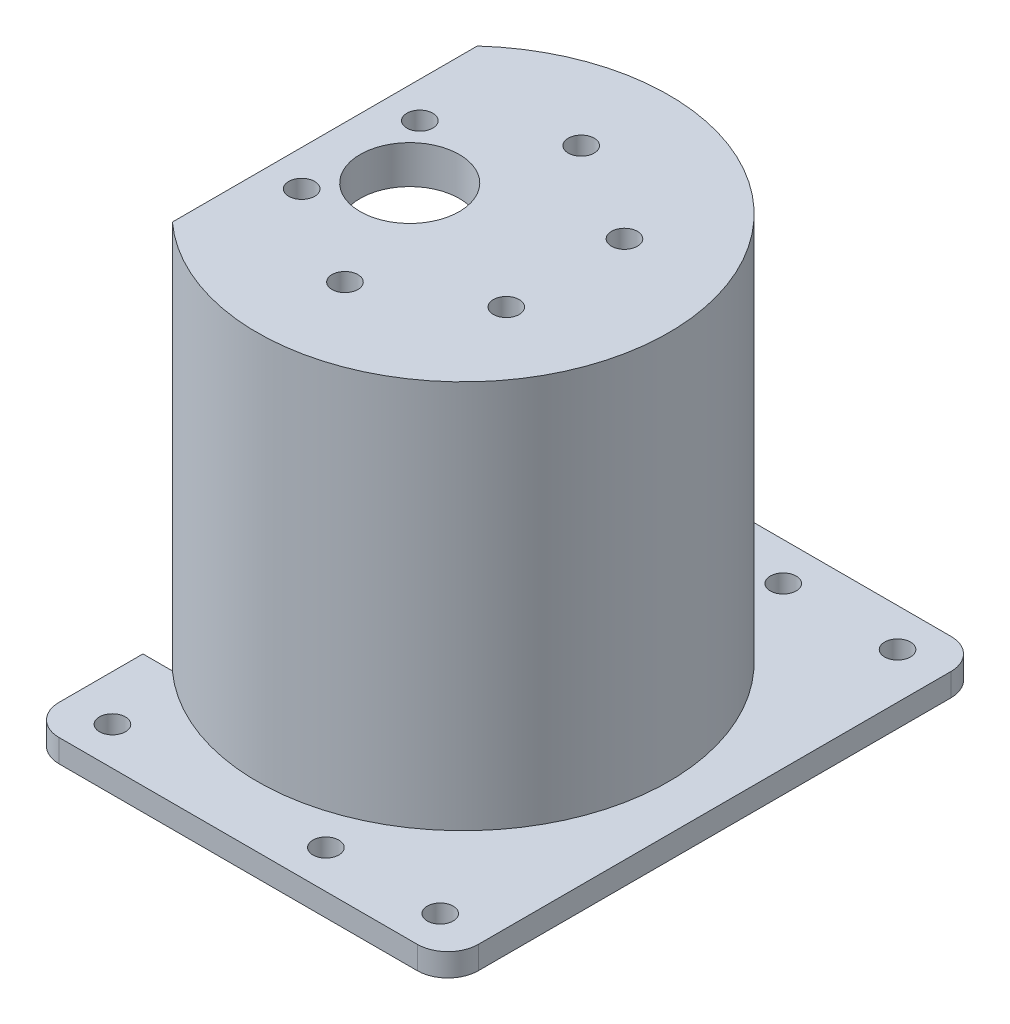
ISO-10303-21;
HEADER;
FILE_DESCRIPTION(('STEP AP214'),'2;1');
FILE_NAME('part.step','',(''),(''),'','','');
FILE_SCHEMA(('AUTOMOTIVE_DESIGN { 1 0 10303 214 1 1 1 1 }'));
ENDSEC;
DATA;
#1=APPLICATION_CONTEXT('core data for automotive mechanical design processes');
#2=APPLICATION_PROTOCOL_DEFINITION('international standard','automotive_design',2000,#1);
#3=PRODUCT_CONTEXT('',#1,'mechanical');
#4=PRODUCT('Part','Part','',(#3));
#5=PRODUCT_RELATED_PRODUCT_CATEGORY('part','',(#4));
#6=PRODUCT_DEFINITION_FORMATION('','',#4);
#7=PRODUCT_DEFINITION_CONTEXT('part definition',#1,'design');
#8=PRODUCT_DEFINITION('design','',#6,#7);
#9=PRODUCT_DEFINITION_SHAPE('','',#8);
#10=(LENGTH_UNIT() NAMED_UNIT(*) SI_UNIT(.MILLI.,.METRE.));
#11=(NAMED_UNIT(*) PLANE_ANGLE_UNIT() SI_UNIT($,.RADIAN.));
#12=(NAMED_UNIT(*) SI_UNIT($,.STERADIAN.) SOLID_ANGLE_UNIT());
#13=UNCERTAINTY_MEASURE_WITH_UNIT(LENGTH_MEASURE(1.E-05),#10,'distance_accuracy_value','');
#14=(GEOMETRIC_REPRESENTATION_CONTEXT(3) GLOBAL_UNCERTAINTY_ASSIGNED_CONTEXT((#13)) GLOBAL_UNIT_ASSIGNED_CONTEXT((#10,
#11,#12)) REPRESENTATION_CONTEXT('',''));
#15=CARTESIAN_POINT('',(0.,0.,0.));
#16=DIRECTION('',(0.,0.,1.));
#17=DIRECTION('',(1.,0.,0.));
#18=AXIS2_PLACEMENT_3D('',#15,#16,#17);
#19=CARTESIAN_POINT('',(-27.5,3.,-20.));
#20=DIRECTION('',(0.,0.,-1.));
#21=DIRECTION('',(-1.,0.,0.));
#22=AXIS2_PLACEMENT_3D('',#19,#20,#21);
#23=PLANE('',#22);
#24=DIRECTION('',(1.,0.,0.));
#25=VECTOR('',#24,1.);
#26=CARTESIAN_POINT('',(-27.5,49.,-20.));
#27=LINE('',#26,#25);
#28=CARTESIAN_POINT('',(-23.638357147217,49.,-20.));
#29=VERTEX_POINT('',#28);
#30=CARTESIAN_POINT('',(-12.5,49.,-20.));
#31=VERTEX_POINT('',#30);
#32=EDGE_CURVE('E174',#29,#31,#27,.T.);
#33=ORIENTED_EDGE('',*,*,#32,.F.);
#34=DIRECTION('',(0.,-1.,0.));
#35=VECTOR('',#34,1.);
#36=CARTESIAN_POINT('',(-23.638357147217,54.,-20.));
#37=LINE('',#36,#35);
#38=CARTESIAN_POINT('',(-23.638357147217,3.,-20.));
#39=VERTEX_POINT('',#38);
#40=EDGE_CURVE('E169',#29,#39,#37,.T.);
#41=ORIENTED_EDGE('',*,*,#40,.T.);
#42=DIRECTION('',(1.,0.,0.));
#43=VECTOR('',#42,1.);
#44=CARTESIAN_POINT('',(-27.5,3.,-20.));
#45=LINE('',#44,#43);
#46=CARTESIAN_POINT('',(-27.5,3.,-20.));
#47=VERTEX_POINT('',#46);
#48=EDGE_CURVE('E214',#47,#39,#45,.T.);
#49=ORIENTED_EDGE('',*,*,#48,.F.);
#50=DIRECTION('',(0.,-1.,0.));
#51=VECTOR('',#50,1.);
#52=CARTESIAN_POINT('',(-27.5,3.,-20.));
#53=LINE('',#52,#51);
#54=CARTESIAN_POINT('',(-27.5,0.,-20.));
#55=VERTEX_POINT('',#54);
#56=EDGE_CURVE('E263',#47,#55,#53,.T.);
#57=ORIENTED_EDGE('',*,*,#56,.T.);
#58=DIRECTION('',(1.,0.,0.));
#59=VECTOR('',#58,1.);
#60=CARTESIAN_POINT('',(-27.5,0.,-20.));
#61=LINE('',#60,#59);
#62=CARTESIAN_POINT('',(-12.5,0.,-20.));
#63=VERTEX_POINT('',#62);
#64=EDGE_CURVE('E237',#55,#63,#61,.T.);
#65=ORIENTED_EDGE('',*,*,#64,.T.);
#66=DIRECTION('',(0.,-1.,0.));
#67=VECTOR('',#66,1.);
#68=CARTESIAN_POINT('',(-12.5,3.,-20.));
#69=LINE('',#68,#67);
#70=EDGE_CURVE('E184',#31,#63,#69,.T.);
#71=ORIENTED_EDGE('',*,*,#70,.F.);
#72=EDGE_LOOP('',(#33,#41,#49,#57,#65,#71));
#73=FACE_BOUND('',#72,.T.);
#74=ADVANCED_FACE('F41',(#73),#23,.F.);
#75=CARTESIAN_POINT('',(-12.5,3.,-24.));
#76=DIRECTION('',(0.,-1.,0.));
#77=DIRECTION('',(0.,0.,-1.));
#78=AXIS2_PLACEMENT_3D('',#75,#76,#77);
#79=CYLINDRICAL_SURFACE('',#78,4.);
#80=CARTESIAN_POINT('',(-12.5,49.,-24.));
#81=DIRECTION('',(0.,1.,0.));
#82=DIRECTION('',(0.,0.,1.));
#83=AXIS2_PLACEMENT_3D('',#80,#81,#82);
#84=CIRCLE('',#83,4.);
#85=CARTESIAN_POINT('',(-11.38,49.,-20.16));
#86=VERTEX_POINT('',#85);
#87=EDGE_CURVE('E186',#31,#86,#84,.T.);
#88=ORIENTED_EDGE('',*,*,#87,.F.);
#89=ORIENTED_EDGE('',*,*,#70,.T.);
#90=CARTESIAN_POINT('',(-12.5,0.,-24.));
#91=DIRECTION('',(0.,1.,0.));
#92=DIRECTION('',(0.,0.,1.));
#93=AXIS2_PLACEMENT_3D('',#90,#91,#92);
#94=CIRCLE('',#93,4.);
#95=CARTESIAN_POINT('',(-11.38,0.,-20.16));
#96=VERTEX_POINT('',#95);
#97=EDGE_CURVE('E239',#63,#96,#94,.T.);
#98=ORIENTED_EDGE('',*,*,#97,.T.);
#99=DIRECTION('',(0.,-1.,0.));
#100=VECTOR('',#99,1.);
#101=CARTESIAN_POINT('',(-11.38,3.,-20.16));
#102=LINE('',#101,#100);
#103=EDGE_CURVE('E260',#86,#96,#102,.T.);
#104=ORIENTED_EDGE('',*,*,#103,.F.);
#105=EDGE_LOOP('',(#88,#89,#98,#104));
#106=FACE_BOUND('',#105,.T.);
#107=ADVANCED_FACE('F318',(#106),#79,.T.);
#108=CARTESIAN_POINT('',(-5.50000000000001,3.,0.));
#109=DIRECTION('',(0.,-1.,0.));
#110=DIRECTION('',(0.,0.,-1.));
#111=AXIS2_PLACEMENT_3D('',#108,#109,#110);
#112=CYLINDRICAL_SURFACE('',#111,21.);
#113=CARTESIAN_POINT('',(-5.50000000000001,49.,0.));
#114=DIRECTION('',(0.,1.,0.));
#115=DIRECTION('',(0.,0.,1.));
#116=AXIS2_PLACEMENT_3D('',#113,#114,#115);
#117=CIRCLE('',#116,21.);
#118=CARTESIAN_POINT('',(-11.38,49.,20.16));
#119=VERTEX_POINT('',#118);
#120=EDGE_CURVE('E309',#86,#119,#117,.F.);
#121=ORIENTED_EDGE('',*,*,#120,.F.);
#122=ORIENTED_EDGE('',*,*,#103,.T.);
#123=CARTESIAN_POINT('',(-5.50000000000001,0.,0.));
#124=DIRECTION('',(0.,-1.,0.));
#125=DIRECTION('',(0.,0.,1.));
#126=AXIS2_PLACEMENT_3D('',#123,#124,#125);
#127=CIRCLE('',#126,21.);
#128=CARTESIAN_POINT('',(-11.38,0.,20.16));
#129=VERTEX_POINT('',#128);
#130=EDGE_CURVE('E242',#96,#129,#127,.T.);
#131=ORIENTED_EDGE('',*,*,#130,.T.);
#132=DIRECTION('',(0.,-1.,0.));
#133=VECTOR('',#132,1.);
#134=CARTESIAN_POINT('',(-11.38,3.,20.16));
#135=LINE('',#134,#133);
#136=EDGE_CURVE('E258',#119,#129,#135,.T.);
#137=ORIENTED_EDGE('',*,*,#136,.F.);
#138=EDGE_LOOP('',(#121,#122,#131,#137));
#139=FACE_BOUND('',#138,.T.);
#140=ADVANCED_FACE('F317',(#139),#112,.F.);
#141=CARTESIAN_POINT('',(-12.5,3.,24.));
#142=DIRECTION('',(0.,-1.,0.));
#143=DIRECTION('',(0.,0.,-1.));
#144=AXIS2_PLACEMENT_3D('',#141,#142,#143);
#145=CYLINDRICAL_SURFACE('',#144,4.);
#146=CARTESIAN_POINT('',(-12.5,49.,24.));
#147=DIRECTION('',(0.,1.,0.));
#148=DIRECTION('',(0.,0.,1.));
#149=AXIS2_PLACEMENT_3D('',#146,#147,#148);
#150=CIRCLE('',#149,4.);
#151=CARTESIAN_POINT('',(-12.5,49.,20.));
#152=VERTEX_POINT('',#151);
#153=EDGE_CURVE('E307',#119,#152,#150,.T.);
#154=ORIENTED_EDGE('',*,*,#153,.F.);
#155=ORIENTED_EDGE('',*,*,#136,.T.);
#156=CARTESIAN_POINT('',(-12.5,0.,24.));
#157=DIRECTION('',(0.,1.,0.));
#158=DIRECTION('',(0.,0.,-1.));
#159=AXIS2_PLACEMENT_3D('',#156,#157,#158);
#160=CIRCLE('',#159,4.);
#161=CARTESIAN_POINT('',(-12.5,0.,20.));
#162=VERTEX_POINT('',#161);
#163=EDGE_CURVE('E245',#129,#162,#160,.T.);
#164=ORIENTED_EDGE('',*,*,#163,.T.);
#165=DIRECTION('',(0.,-1.,0.));
#166=VECTOR('',#165,1.);
#167=CARTESIAN_POINT('',(-12.5,3.,20.));
#168=LINE('',#167,#166);
#169=EDGE_CURVE('E256',#152,#162,#168,.T.);
#170=ORIENTED_EDGE('',*,*,#169,.F.);
#171=EDGE_LOOP('',(#154,#155,#164,#170));
#172=FACE_BOUND('',#171,.T.);
#173=ADVANCED_FACE('F330',(#172),#145,.T.);
#174=CARTESIAN_POINT('',(-27.5,3.,20.));
#175=DIRECTION('',(0.,0.,1.));
#176=DIRECTION('',(1.,0.,0.));
#177=AXIS2_PLACEMENT_3D('',#174,#175,#176);
#178=PLANE('',#177);
#179=DIRECTION('',(-1.,0.,0.));
#180=VECTOR('',#179,1.);
#181=CARTESIAN_POINT('',(-27.5,49.,20.));
#182=LINE('',#181,#180);
#183=CARTESIAN_POINT('',(-23.6383571472171,49.,20.));
#184=VERTEX_POINT('',#183);
#185=EDGE_CURVE('E177',#152,#184,#182,.T.);
#186=ORIENTED_EDGE('',*,*,#185,.F.);
#187=ORIENTED_EDGE('',*,*,#169,.T.);
#188=DIRECTION('',(-1.,0.,0.));
#189=VECTOR('',#188,1.);
#190=CARTESIAN_POINT('',(-27.5,0.,20.));
#191=LINE('',#190,#189);
#192=CARTESIAN_POINT('',(-27.5,0.,20.));
#193=VERTEX_POINT('',#192);
#194=EDGE_CURVE('E248',#162,#193,#191,.T.);
#195=ORIENTED_EDGE('',*,*,#194,.T.);
#196=DIRECTION('',(0.,-1.,0.));
#197=VECTOR('',#196,1.);
#198=CARTESIAN_POINT('',(-27.5,3.,20.));
#199=LINE('',#198,#197);
#200=CARTESIAN_POINT('',(-27.5,3.,20.));
#201=VERTEX_POINT('',#200);
#202=EDGE_CURVE('E253',#201,#193,#199,.T.);
#203=ORIENTED_EDGE('',*,*,#202,.F.);
#204=DIRECTION('',(-1.,0.,0.));
#205=VECTOR('',#204,1.);
#206=CARTESIAN_POINT('',(-27.5,3.,20.));
#207=LINE('',#206,#205);
#208=CARTESIAN_POINT('',(-23.6383571472171,3.,20.));
#209=VERTEX_POINT('',#208);
#210=EDGE_CURVE('E216',#209,#201,#207,.T.);
#211=ORIENTED_EDGE('',*,*,#210,.F.);
#212=DIRECTION('',(0.,-1.,0.));
#213=VECTOR('',#212,1.);
#214=CARTESIAN_POINT('',(-23.6383571472171,54.,20.));
#215=LINE('',#214,#213);
#216=EDGE_CURVE('E66',#184,#209,#215,.T.);
#217=ORIENTED_EDGE('',*,*,#216,.F.);
#218=EDGE_LOOP('',(#186,#187,#195,#203,#211,#217));
#219=FACE_BOUND('',#218,.T.);
#220=ADVANCED_FACE('F332',(#219),#178,.F.);
#221=CARTESIAN_POINT('',(-23.5,3.,31.));
#222=DIRECTION('',(0.,-1.,0.));
#223=DIRECTION('',(0.,0.,-1.));
#224=AXIS2_PLACEMENT_3D('',#221,#222,#223);
#225=CYLINDRICAL_SURFACE('',#224,4.);
#226=CARTESIAN_POINT('',(-23.5,0.,31.));
#227=DIRECTION('',(0.,1.,0.));
#228=DIRECTION('',(0.,0.,1.));
#229=AXIS2_PLACEMENT_3D('',#226,#227,#228);
#230=CIRCLE('',#229,4.);
#231=CARTESIAN_POINT('',(-27.5,0.,31.));
#232=VERTEX_POINT('',#231);
#233=CARTESIAN_POINT('',(-23.5,0.,35.));
#234=VERTEX_POINT('',#233);
#235=EDGE_CURVE('E195',#232,#234,#230,.T.);
#236=ORIENTED_EDGE('',*,*,#235,.T.);
#237=DIRECTION('',(0.,-1.,0.));
#238=VECTOR('',#237,1.);
#239=CARTESIAN_POINT('',(-23.5,3.,35.));
#240=LINE('',#239,#238);
#241=CARTESIAN_POINT('',(-23.5,3.,35.));
#242=VERTEX_POINT('',#241);
#243=EDGE_CURVE('E11',#242,#234,#240,.T.);
#244=ORIENTED_EDGE('',*,*,#243,.F.);
#245=CARTESIAN_POINT('',(-23.5,3.,31.));
#246=DIRECTION('',(0.,1.,0.));
#247=DIRECTION('',(0.,0.,1.));
#248=AXIS2_PLACEMENT_3D('',#245,#246,#247);
#249=CIRCLE('',#248,4.);
#250=CARTESIAN_POINT('',(-27.5,3.,31.));
#251=VERTEX_POINT('',#250);
#252=EDGE_CURVE('E196',#251,#242,#249,.T.);
#253=ORIENTED_EDGE('',*,*,#252,.F.);
#254=DIRECTION('',(0.,-1.,0.));
#255=VECTOR('',#254,1.);
#256=CARTESIAN_POINT('',(-27.5,3.,31.));
#257=LINE('',#256,#255);
#258=EDGE_CURVE('E220',#251,#232,#257,.T.);
#259=ORIENTED_EDGE('',*,*,#258,.T.);
#260=EDGE_LOOP('',(#236,#244,#253,#259));
#261=FACE_BOUND('',#260,.T.);
#262=ADVANCED_FACE('F43',(#261),#225,.T.);
#263=CARTESIAN_POINT('',(-23.5,3.,35.));
#264=DIRECTION('',(0.,0.,-1.));
#265=DIRECTION('',(-1.,0.,0.));
#266=AXIS2_PLACEMENT_3D('',#263,#264,#265);
#267=PLANE('',#266);
#268=DIRECTION('',(1.,0.,0.));
#269=VECTOR('',#268,1.);
#270=CARTESIAN_POINT('',(-23.5,0.,35.));
#271=LINE('',#270,#269);
#272=CARTESIAN_POINT('',(23.5,0.,35.));
#273=VERTEX_POINT('',#272);
#274=EDGE_CURVE('E223',#234,#273,#271,.T.);
#275=ORIENTED_EDGE('',*,*,#274,.T.);
#276=DIRECTION('',(0.,-1.,0.));
#277=VECTOR('',#276,1.);
#278=CARTESIAN_POINT('',(23.5,3.,35.));
#279=LINE('',#278,#277);
#280=CARTESIAN_POINT('',(23.5,3.,35.));
#281=VERTEX_POINT('',#280);
#282=EDGE_CURVE('E50',#281,#273,#279,.T.);
#283=ORIENTED_EDGE('',*,*,#282,.F.);
#284=DIRECTION('',(1.,0.,0.));
#285=VECTOR('',#284,1.);
#286=CARTESIAN_POINT('',(-23.5,3.,35.));
#287=LINE('',#286,#285);
#288=EDGE_CURVE('E199',#242,#281,#287,.T.);
#289=ORIENTED_EDGE('',*,*,#288,.F.);
#290=ORIENTED_EDGE('',*,*,#243,.T.);
#291=EDGE_LOOP('',(#275,#283,#289,#290));
#292=FACE_BOUND('',#291,.T.);
#293=ADVANCED_FACE('F382',(#292),#267,.F.);
#294=CARTESIAN_POINT('',(23.5,3.,31.));
#295=DIRECTION('',(0.,-1.,0.));
#296=DIRECTION('',(0.,0.,-1.));
#297=AXIS2_PLACEMENT_3D('',#294,#295,#296);
#298=CYLINDRICAL_SURFACE('',#297,4.);
#299=CARTESIAN_POINT('',(23.5,0.,31.));
#300=DIRECTION('',(0.,1.,0.));
#301=DIRECTION('',(0.,0.,1.));
#302=AXIS2_PLACEMENT_3D('',#299,#300,#301);
#303=CIRCLE('',#302,4.);
#304=CARTESIAN_POINT('',(27.5,0.,31.));
#305=VERTEX_POINT('',#304);
#306=EDGE_CURVE('E225',#273,#305,#303,.T.);
#307=ORIENTED_EDGE('',*,*,#306,.T.);
#308=DIRECTION('',(0.,-1.,0.));
#309=VECTOR('',#308,1.);
#310=CARTESIAN_POINT('',(27.5,3.,31.));
#311=LINE('',#310,#309);
#312=CARTESIAN_POINT('',(27.5,3.,31.));
#313=VERTEX_POINT('',#312);
#314=EDGE_CURVE('E278',#313,#305,#311,.T.);
#315=ORIENTED_EDGE('',*,*,#314,.F.);
#316=CARTESIAN_POINT('',(23.5,3.,31.));
#317=DIRECTION('',(0.,1.,0.));
#318=DIRECTION('',(0.,0.,1.));
#319=AXIS2_PLACEMENT_3D('',#316,#317,#318);
#320=CIRCLE('',#319,4.);
#321=EDGE_CURVE('E202',#281,#313,#320,.T.);
#322=ORIENTED_EDGE('',*,*,#321,.F.);
#323=ORIENTED_EDGE('',*,*,#282,.T.);
#324=EDGE_LOOP('',(#307,#315,#322,#323));
#325=FACE_BOUND('',#324,.T.);
#326=ADVANCED_FACE('F379',(#325),#298,.T.);
#327=CARTESIAN_POINT('',(27.5,3.,-31.));
#328=DIRECTION('',(-1.,0.,0.));
#329=DIRECTION('',(0.,0.,1.));
#330=AXIS2_PLACEMENT_3D('',#327,#328,#329);
#331=PLANE('',#330);
#332=DIRECTION('',(0.,0.,-1.));
#333=VECTOR('',#332,1.);
#334=CARTESIAN_POINT('',(27.5,0.,-31.));
#335=LINE('',#334,#333);
#336=CARTESIAN_POINT('',(27.5,0.,-31.));
#337=VERTEX_POINT('',#336);
#338=EDGE_CURVE('E227',#305,#337,#335,.T.);
#339=ORIENTED_EDGE('',*,*,#338,.T.);
#340=DIRECTION('',(0.,-1.,0.));
#341=VECTOR('',#340,1.);
#342=CARTESIAN_POINT('',(27.5,3.,-31.));
#343=LINE('',#342,#341);
#344=CARTESIAN_POINT('',(27.5,3.,-31.));
#345=VERTEX_POINT('',#344);
#346=EDGE_CURVE('E275',#345,#337,#343,.T.);
#347=ORIENTED_EDGE('',*,*,#346,.F.);
#348=DIRECTION('',(0.,0.,-1.));
#349=VECTOR('',#348,1.);
#350=CARTESIAN_POINT('',(27.5,3.,-31.));
#351=LINE('',#350,#349);
#352=EDGE_CURVE('E204',#313,#345,#351,.T.);
#353=ORIENTED_EDGE('',*,*,#352,.F.);
#354=ORIENTED_EDGE('',*,*,#314,.T.);
#355=EDGE_LOOP('',(#339,#347,#353,#354));
#356=FACE_BOUND('',#355,.T.);
#357=ADVANCED_FACE('F375',(#356),#331,.F.);
#358=CARTESIAN_POINT('',(23.5,3.,-31.));
#359=DIRECTION('',(0.,-1.,0.));
#360=DIRECTION('',(0.,0.,-1.));
#361=AXIS2_PLACEMENT_3D('',#358,#359,#360);
#362=CYLINDRICAL_SURFACE('',#361,4.);
#363=CARTESIAN_POINT('',(23.5,0.,-31.));
#364=DIRECTION('',(0.,1.,0.));
#365=DIRECTION('',(0.,0.,-1.));
#366=AXIS2_PLACEMENT_3D('',#363,#364,#365);
#367=CIRCLE('',#366,4.);
#368=CARTESIAN_POINT('',(23.5,0.,-35.));
#369=VERTEX_POINT('',#368);
#370=EDGE_CURVE('E229',#337,#369,#367,.T.);
#371=ORIENTED_EDGE('',*,*,#370,.T.);
#372=DIRECTION('',(0.,-1.,0.));
#373=VECTOR('',#372,1.);
#374=CARTESIAN_POINT('',(23.5,3.,-35.));
#375=LINE('',#374,#373);
#376=CARTESIAN_POINT('',(23.5,3.,-35.));
#377=VERTEX_POINT('',#376);
#378=EDGE_CURVE('E272',#377,#369,#375,.T.);
#379=ORIENTED_EDGE('',*,*,#378,.F.);
#380=CARTESIAN_POINT('',(23.5,3.,-31.));
#381=DIRECTION('',(0.,1.,0.));
#382=DIRECTION('',(0.,0.,-1.));
#383=AXIS2_PLACEMENT_3D('',#380,#381,#382);
#384=CIRCLE('',#383,4.);
#385=EDGE_CURVE('E206',#345,#377,#384,.T.);
#386=ORIENTED_EDGE('',*,*,#385,.F.);
#387=ORIENTED_EDGE('',*,*,#346,.T.);
#388=EDGE_LOOP('',(#371,#379,#386,#387));
#389=FACE_BOUND('',#388,.T.);
#390=ADVANCED_FACE('F371',(#389),#362,.T.);
#391=CARTESIAN_POINT('',(-23.5,3.,-35.));
#392=DIRECTION('',(0.,0.,1.));
#393=DIRECTION('',(1.,0.,0.));
#394=AXIS2_PLACEMENT_3D('',#391,#392,#393);
#395=PLANE('',#394);
#396=DIRECTION('',(-1.,0.,0.));
#397=VECTOR('',#396,1.);
#398=CARTESIAN_POINT('',(-23.5,0.,-35.));
#399=LINE('',#398,#397);
#400=CARTESIAN_POINT('',(-23.5,0.,-35.));
#401=VERTEX_POINT('',#400);
#402=EDGE_CURVE('E231',#369,#401,#399,.T.);
#403=ORIENTED_EDGE('',*,*,#402,.T.);
#404=DIRECTION('',(0.,-1.,0.));
#405=VECTOR('',#404,1.);
#406=CARTESIAN_POINT('',(-23.5,3.,-35.));
#407=LINE('',#406,#405);
#408=CARTESIAN_POINT('',(-23.5,3.,-35.));
#409=VERTEX_POINT('',#408);
#410=EDGE_CURVE('E269',#409,#401,#407,.T.);
#411=ORIENTED_EDGE('',*,*,#410,.F.);
#412=DIRECTION('',(-1.,0.,0.));
#413=VECTOR('',#412,1.);
#414=CARTESIAN_POINT('',(-23.5,3.,-35.));
#415=LINE('',#414,#413);
#416=EDGE_CURVE('E208',#377,#409,#415,.T.);
#417=ORIENTED_EDGE('',*,*,#416,.F.);
#418=ORIENTED_EDGE('',*,*,#378,.T.);
#419=EDGE_LOOP('',(#403,#411,#417,#418));
#420=FACE_BOUND('',#419,.T.);
#421=ADVANCED_FACE('F367',(#420),#395,.F.);
#422=CARTESIAN_POINT('',(-23.5,3.,-31.));
#423=DIRECTION('',(0.,-1.,0.));
#424=DIRECTION('',(0.,0.,-1.));
#425=AXIS2_PLACEMENT_3D('',#422,#423,#424);
#426=CYLINDRICAL_SURFACE('',#425,4.);
#427=CARTESIAN_POINT('',(-23.5,0.,-31.));
#428=DIRECTION('',(0.,1.,0.));
#429=DIRECTION('',(0.,0.,1.));
#430=AXIS2_PLACEMENT_3D('',#427,#428,#429);
#431=CIRCLE('',#430,4.);
#432=CARTESIAN_POINT('',(-27.5,0.,-31.));
#433=VERTEX_POINT('',#432);
#434=EDGE_CURVE('E233',#401,#433,#431,.T.);
#435=ORIENTED_EDGE('',*,*,#434,.T.);
#436=DIRECTION('',(0.,-1.,0.));
#437=VECTOR('',#436,1.);
#438=CARTESIAN_POINT('',(-27.5,3.,-31.));
#439=LINE('',#438,#437);
#440=CARTESIAN_POINT('',(-27.5,3.,-31.));
#441=VERTEX_POINT('',#440);
#442=EDGE_CURVE('E266',#441,#433,#439,.T.);
#443=ORIENTED_EDGE('',*,*,#442,.F.);
#444=CARTESIAN_POINT('',(-23.5,3.,-31.));
#445=DIRECTION('',(0.,1.,0.));
#446=DIRECTION('',(0.,0.,1.));
#447=AXIS2_PLACEMENT_3D('',#444,#445,#446);
#448=CIRCLE('',#447,4.);
#449=EDGE_CURVE('E210',#409,#441,#448,.T.);
#450=ORIENTED_EDGE('',*,*,#449,.F.);
#451=ORIENTED_EDGE('',*,*,#410,.T.);
#452=EDGE_LOOP('',(#435,#443,#450,#451));
#453=FACE_BOUND('',#452,.T.);
#454=ADVANCED_FACE('F363',(#453),#426,.T.);
#455=CARTESIAN_POINT('',(-27.5,3.,-31.));
#456=DIRECTION('',(1.,0.,0.));
#457=DIRECTION('',(0.,0.,-1.));
#458=AXIS2_PLACEMENT_3D('',#455,#456,#457);
#459=PLANE('',#458);
#460=DIRECTION('',(0.,0.,1.));
#461=VECTOR('',#460,1.);
#462=CARTESIAN_POINT('',(-27.5,0.,-31.));
#463=LINE('',#462,#461);
#464=EDGE_CURVE('E235',#433,#55,#463,.T.);
#465=ORIENTED_EDGE('',*,*,#464,.T.);
#466=ORIENTED_EDGE('',*,*,#56,.F.);
#467=DIRECTION('',(0.,0.,1.));
#468=VECTOR('',#467,1.);
#469=CARTESIAN_POINT('',(-27.5,3.,-31.));
#470=LINE('',#469,#468);
#471=EDGE_CURVE('E212',#441,#47,#470,.T.);
#472=ORIENTED_EDGE('',*,*,#471,.F.);
#473=ORIENTED_EDGE('',*,*,#442,.T.);
#474=EDGE_LOOP('',(#465,#466,#472,#473));
#475=FACE_BOUND('',#474,.T.);
#476=ADVANCED_FACE('F359',(#475),#459,.F.);
#477=CARTESIAN_POINT('',(-27.5,3.,20.));
#478=DIRECTION('',(1.,0.,0.));
#479=DIRECTION('',(0.,0.,-1.));
#480=AXIS2_PLACEMENT_3D('',#477,#478,#479);
#481=PLANE('',#480);
#482=DIRECTION('',(0.,0.,1.));
#483=VECTOR('',#482,1.);
#484=CARTESIAN_POINT('',(-27.5,0.,20.));
#485=LINE('',#484,#483);
#486=EDGE_CURVE('E200',#193,#232,#485,.T.);
#487=ORIENTED_EDGE('',*,*,#486,.T.);
#488=ORIENTED_EDGE('',*,*,#258,.F.);
#489=DIRECTION('',(0.,0.,1.));
#490=VECTOR('',#489,1.);
#491=CARTESIAN_POINT('',(-27.5,3.,20.));
#492=LINE('',#491,#490);
#493=EDGE_CURVE('E218',#201,#251,#492,.T.);
#494=ORIENTED_EDGE('',*,*,#493,.F.);
#495=ORIENTED_EDGE('',*,*,#202,.T.);
#496=EDGE_LOOP('',(#487,#488,#494,#495));
#497=FACE_BOUND('',#496,.T.);
#498=ADVANCED_FACE('F362',(#497),#481,.F.);
#499=CARTESIAN_POINT('',(-23.5,3.,31.));
#500=DIRECTION('',(0.,1.,0.));
#501=DIRECTION('',(0.,0.,1.));
#502=AXIS2_PLACEMENT_3D('',#499,#500,#501);
#503=PLANE('',#502);
#504=CARTESIAN_POINT('',(6.49999999999999,3.,30.));
#505=DIRECTION('',(0.,1.,0.));
#506=DIRECTION('',(0.,0.,1.));
#507=AXIS2_PLACEMENT_3D('',#504,#505,#506);
#508=CIRCLE('',#507,1.7);
#509=CARTESIAN_POINT('',(6.49999999999999,3.,31.7));
#510=VERTEX_POINT('',#509);
#511=EDGE_CURVE('E610',#510,#510,#508,.T.);
#512=ORIENTED_EDGE('',*,*,#511,.F.);
#513=EDGE_LOOP('',(#512));
#514=FACE_BOUND('',#513,.T.);
#515=CARTESIAN_POINT('',(21.5,3.,30.));
#516=DIRECTION('',(0.,1.,0.));
#517=DIRECTION('',(0.,0.,1.));
#518=AXIS2_PLACEMENT_3D('',#515,#516,#517);
#519=CIRCLE('',#518,1.7);
#520=CARTESIAN_POINT('',(21.5,3.,31.7));
#521=VERTEX_POINT('',#520);
#522=EDGE_CURVE('E613',#521,#521,#519,.T.);
#523=ORIENTED_EDGE('',*,*,#522,.F.);
#524=EDGE_LOOP('',(#523));
#525=FACE_BOUND('',#524,.T.);
#526=CARTESIAN_POINT('',(21.5,3.,-30.));
#527=DIRECTION('',(0.,1.,0.));
#528=DIRECTION('',(0.,0.,1.));
#529=AXIS2_PLACEMENT_3D('',#526,#527,#528);
#530=CIRCLE('',#529,1.7);
#531=CARTESIAN_POINT('',(21.5,3.,-28.3));
#532=VERTEX_POINT('',#531);
#533=EDGE_CURVE('E616',#532,#532,#530,.T.);
#534=ORIENTED_EDGE('',*,*,#533,.F.);
#535=EDGE_LOOP('',(#534));
#536=FACE_BOUND('',#535,.T.);
#537=CARTESIAN_POINT('',(-21.5,3.,-30.));
#538=DIRECTION('',(0.,1.,0.));
#539=DIRECTION('',(0.,0.,1.));
#540=AXIS2_PLACEMENT_3D('',#537,#538,#539);
#541=CIRCLE('',#540,1.7);
#542=CARTESIAN_POINT('',(-21.5,3.,-28.3));
#543=VERTEX_POINT('',#542);
#544=EDGE_CURVE('E609',#543,#543,#541,.T.);
#545=ORIENTED_EDGE('',*,*,#544,.F.);
#546=EDGE_LOOP('',(#545));
#547=FACE_BOUND('',#546,.T.);
#548=CARTESIAN_POINT('',(6.49999999999999,3.,-30.));
#549=DIRECTION('',(0.,1.,0.));
#550=DIRECTION('',(0.,0.,1.));
#551=AXIS2_PLACEMENT_3D('',#548,#549,#550);
#552=CIRCLE('',#551,1.7);
#553=CARTESIAN_POINT('',(6.49999999999999,3.,-28.3));
#554=VERTEX_POINT('',#553);
#555=EDGE_CURVE('E602',#554,#554,#552,.T.);
#556=ORIENTED_EDGE('',*,*,#555,.F.);
#557=EDGE_LOOP('',(#556));
#558=FACE_BOUND('',#557,.T.);
#559=CARTESIAN_POINT('',(-21.5,3.,30.));
#560=DIRECTION('',(0.,1.,0.));
#561=DIRECTION('',(0.,0.,1.));
#562=AXIS2_PLACEMENT_3D('',#559,#560,#561);
#563=CIRCLE('',#562,1.7);
#564=CARTESIAN_POINT('',(-21.5,3.,31.7));
#565=VERTEX_POINT('',#564);
#566=EDGE_CURVE('E287',#565,#565,#563,.T.);
#567=ORIENTED_EDGE('',*,*,#566,.F.);
#568=EDGE_LOOP('',(#567));
#569=FACE_BOUND('',#568,.T.);
#570=CARTESIAN_POINT('',(-5.50000000000001,3.,0.));
#571=DIRECTION('',(0.,1.,0.));
#572=DIRECTION('',(0.,0.,1.));
#573=AXIS2_PLACEMENT_3D('',#570,#571,#572);
#574=CIRCLE('',#573,27.);
#575=EDGE_CURVE('E185',#209,#39,#574,.T.);
#576=ORIENTED_EDGE('',*,*,#575,.F.);
#577=ORIENTED_EDGE('',*,*,#210,.T.);
#578=ORIENTED_EDGE('',*,*,#493,.T.);
#579=ORIENTED_EDGE('',*,*,#252,.T.);
#580=ORIENTED_EDGE('',*,*,#288,.T.);
#581=ORIENTED_EDGE('',*,*,#321,.T.);
#582=ORIENTED_EDGE('',*,*,#352,.T.);
#583=ORIENTED_EDGE('',*,*,#385,.T.);
#584=ORIENTED_EDGE('',*,*,#416,.T.);
#585=ORIENTED_EDGE('',*,*,#449,.T.);
#586=ORIENTED_EDGE('',*,*,#471,.T.);
#587=ORIENTED_EDGE('',*,*,#48,.T.);
#588=EDGE_LOOP('',(#576,#577,#578,#579,#580,#581,#582,#583,#584,#585,#586,#587));
#589=FACE_BOUND('',#588,.T.);
#590=ADVANCED_FACE('F404',(#514,#525,#536,#547,#558,#569,#589),#503,.T.);
#591=CARTESIAN_POINT('',(-23.5,0.,31.));
#592=DIRECTION('',(0.,1.,0.));
#593=DIRECTION('',(0.,0.,1.));
#594=AXIS2_PLACEMENT_3D('',#591,#592,#593);
#595=PLANE('',#594);
#596=CARTESIAN_POINT('',(6.49999999999999,0.,30.));
#597=DIRECTION('',(0.,1.,0.));
#598=DIRECTION('',(0.,0.,1.));
#599=AXIS2_PLACEMENT_3D('',#596,#597,#598);
#600=CIRCLE('',#599,1.7);
#601=CARTESIAN_POINT('',(6.49999999999999,0.,31.7));
#602=VERTEX_POINT('',#601);
#603=EDGE_CURVE('E45',#602,#602,#600,.T.);
#604=ORIENTED_EDGE('',*,*,#603,.T.);
#605=EDGE_LOOP('',(#604));
#606=FACE_BOUND('',#605,.T.);
#607=CARTESIAN_POINT('',(21.5,0.,30.));
#608=DIRECTION('',(0.,1.,0.));
#609=DIRECTION('',(0.,0.,1.));
#610=AXIS2_PLACEMENT_3D('',#607,#608,#609);
#611=CIRCLE('',#610,1.7);
#612=CARTESIAN_POINT('',(21.5,0.,31.7));
#613=VERTEX_POINT('',#612);
#614=EDGE_CURVE('E295',#613,#613,#611,.T.);
#615=ORIENTED_EDGE('',*,*,#614,.T.);
#616=EDGE_LOOP('',(#615));
#617=FACE_BOUND('',#616,.T.);
#618=CARTESIAN_POINT('',(21.5,0.,-30.));
#619=DIRECTION('',(0.,1.,0.));
#620=DIRECTION('',(0.,0.,1.));
#621=AXIS2_PLACEMENT_3D('',#618,#619,#620);
#622=CIRCLE('',#621,1.7);
#623=CARTESIAN_POINT('',(21.5,0.,-28.3));
#624=VERTEX_POINT('',#623);
#625=EDGE_CURVE('E293',#624,#624,#622,.T.);
#626=ORIENTED_EDGE('',*,*,#625,.T.);
#627=EDGE_LOOP('',(#626));
#628=FACE_BOUND('',#627,.T.);
#629=CARTESIAN_POINT('',(-21.5,0.,-30.));
#630=DIRECTION('',(0.,1.,0.));
#631=DIRECTION('',(0.,0.,1.));
#632=AXIS2_PLACEMENT_3D('',#629,#630,#631);
#633=CIRCLE('',#632,1.7);
#634=CARTESIAN_POINT('',(-21.5,0.,-28.3));
#635=VERTEX_POINT('',#634);
#636=EDGE_CURVE('E290',#635,#635,#633,.T.);
#637=ORIENTED_EDGE('',*,*,#636,.T.);
#638=EDGE_LOOP('',(#637));
#639=FACE_BOUND('',#638,.T.);
#640=CARTESIAN_POINT('',(6.49999999999999,0.,-30.));
#641=DIRECTION('',(0.,1.,0.));
#642=DIRECTION('',(0.,0.,1.));
#643=AXIS2_PLACEMENT_3D('',#640,#641,#642);
#644=CIRCLE('',#643,1.7);
#645=CARTESIAN_POINT('',(6.49999999999999,0.,-28.3));
#646=VERTEX_POINT('',#645);
#647=EDGE_CURVE('E286',#646,#646,#644,.T.);
#648=ORIENTED_EDGE('',*,*,#647,.T.);
#649=EDGE_LOOP('',(#648));
#650=FACE_BOUND('',#649,.T.);
#651=CARTESIAN_POINT('',(-21.5,0.,30.));
#652=DIRECTION('',(0.,1.,0.));
#653=DIRECTION('',(0.,0.,1.));
#654=AXIS2_PLACEMENT_3D('',#651,#652,#653);
#655=CIRCLE('',#654,1.7);
#656=CARTESIAN_POINT('',(-21.5,0.,31.7));
#657=VERTEX_POINT('',#656);
#658=EDGE_CURVE('E283',#657,#657,#655,.T.);
#659=ORIENTED_EDGE('',*,*,#658,.T.);
#660=EDGE_LOOP('',(#659));
#661=FACE_BOUND('',#660,.T.);
#662=ORIENTED_EDGE('',*,*,#235,.F.);
#663=ORIENTED_EDGE('',*,*,#486,.F.);
#664=ORIENTED_EDGE('',*,*,#194,.F.);
#665=ORIENTED_EDGE('',*,*,#163,.F.);
#666=ORIENTED_EDGE('',*,*,#130,.F.);
#667=ORIENTED_EDGE('',*,*,#97,.F.);
#668=ORIENTED_EDGE('',*,*,#64,.F.);
#669=ORIENTED_EDGE('',*,*,#464,.F.);
#670=ORIENTED_EDGE('',*,*,#434,.F.);
#671=ORIENTED_EDGE('',*,*,#402,.F.);
#672=ORIENTED_EDGE('',*,*,#370,.F.);
#673=ORIENTED_EDGE('',*,*,#338,.F.);
#674=ORIENTED_EDGE('',*,*,#306,.F.);
#675=ORIENTED_EDGE('',*,*,#274,.F.);
#676=EDGE_LOOP('',(#662,#663,#664,#665,#666,#667,#668,#669,#670,#671,#672,#673,#674,#675));
#677=FACE_BOUND('',#676,.T.);
#678=ADVANCED_FACE('F325',(#606,#617,#628,#639,#650,#661,#677),#595,.F.);
#679=CARTESIAN_POINT('',(-5.50000000000001,54.,0.));
#680=DIRECTION('',(0.,-1.,0.));
#681=DIRECTION('',(0.,0.,-1.));
#682=AXIS2_PLACEMENT_3D('',#679,#680,#681);
#683=CYLINDRICAL_SURFACE('',#682,27.);
#684=CARTESIAN_POINT('',(-23.6383571472171,54.,20.));
#685=VERTEX_POINT('',#684);
#686=EDGE_CURVE('E193',#685,#184,#215,.T.);
#687=ORIENTED_EDGE('',*,*,#686,.T.);
#688=ORIENTED_EDGE('',*,*,#216,.T.);
#689=ORIENTED_EDGE('',*,*,#575,.T.);
#690=ORIENTED_EDGE('',*,*,#40,.F.);
#691=CARTESIAN_POINT('',(-23.638357147217,54.,-20.));
#692=VERTEX_POINT('',#691);
#693=EDGE_CURVE('E162',#692,#29,#37,.T.);
#694=ORIENTED_EDGE('',*,*,#693,.F.);
#695=CARTESIAN_POINT('',(-5.50000000000001,54.,0.));
#696=DIRECTION('',(0.,1.,0.));
#697=DIRECTION('',(0.,0.,1.));
#698=AXIS2_PLACEMENT_3D('',#695,#696,#697);
#699=CIRCLE('',#698,27.);
#700=EDGE_CURVE('E189',#685,#692,#699,.T.);
#701=ORIENTED_EDGE('',*,*,#700,.F.);
#702=EDGE_LOOP('',(#687,#688,#689,#690,#694,#701));
#703=FACE_BOUND('',#702,.T.);
#704=ADVANCED_FACE('F188',(#703),#683,.T.);
#705=CARTESIAN_POINT('',(-5.50000000000001,54.,0.));
#706=DIRECTION('',(0.,1.,0.));
#707=DIRECTION('',(0.,0.,1.));
#708=AXIS2_PLACEMENT_3D('',#705,#706,#707);
#709=PLANE('',#708);
#710=CARTESIAN_POINT('',(7.9233937586587,54.,7.75000000000015));
#711=DIRECTION('',(0.,1.,0.));
#712=DIRECTION('',(0.,0.,1.));
#713=AXIS2_PLACEMENT_3D('',#710,#711,#712);
#714=CIRCLE('',#713,1.7);
#715=CARTESIAN_POINT('',(7.9233937586587,54.,9.45000000000015));
#716=VERTEX_POINT('',#715);
#717=EDGE_CURVE('E590',#716,#716,#714,.T.);
#718=ORIENTED_EDGE('',*,*,#717,.F.);
#719=EDGE_LOOP('',(#718));
#720=FACE_BOUND('',#719,.T.);
#721=CARTESIAN_POINT('',(7.92339375865887,54.,-7.74999999999988));
#722=DIRECTION('',(0.,1.,0.));
#723=DIRECTION('',(0.,0.,1.));
#724=AXIS2_PLACEMENT_3D('',#721,#722,#723);
#725=CIRCLE('',#724,1.7);
#726=CARTESIAN_POINT('',(7.92339375865887,54.,-6.04999999999988));
#727=VERTEX_POINT('',#726);
#728=EDGE_CURVE('E594',#727,#727,#725,.T.);
#729=ORIENTED_EDGE('',*,*,#728,.F.);
#730=EDGE_LOOP('',(#729));
#731=FACE_BOUND('',#730,.T.);
#732=CARTESIAN_POINT('',(-5.49999999999989,54.,-15.5));
#733=DIRECTION('',(0.,1.,0.));
#734=DIRECTION('',(0.,0.,1.));
#735=AXIS2_PLACEMENT_3D('',#732,#733,#734);
#736=CIRCLE('',#735,1.7);
#737=CARTESIAN_POINT('',(-5.49999999999989,54.,-13.8));
#738=VERTEX_POINT('',#737);
#739=EDGE_CURVE('E668',#738,#738,#736,.T.);
#740=ORIENTED_EDGE('',*,*,#739,.F.);
#741=EDGE_LOOP('',(#740));
#742=FACE_BOUND('',#741,.T.);
#743=CARTESIAN_POINT('',(-18.9233937586588,54.,-7.75000000000007));
#744=DIRECTION('',(0.,1.,0.));
#745=DIRECTION('',(0.,0.,1.));
#746=AXIS2_PLACEMENT_3D('',#743,#744,#745);
#747=CIRCLE('',#746,1.7);
#748=CARTESIAN_POINT('',(-18.9233937586588,54.,-6.05000000000007));
#749=VERTEX_POINT('',#748);
#750=EDGE_CURVE('E662',#749,#749,#747,.T.);
#751=ORIENTED_EDGE('',*,*,#750,.F.);
#752=EDGE_LOOP('',(#751));
#753=FACE_BOUND('',#752,.T.);
#754=CARTESIAN_POINT('',(-18.9233937586588,54.,7.74999999999996));
#755=DIRECTION('',(0.,1.,0.));
#756=DIRECTION('',(0.,0.,1.));
#757=AXIS2_PLACEMENT_3D('',#754,#755,#756);
#758=CIRCLE('',#757,1.7);
#759=CARTESIAN_POINT('',(-18.9233937586588,54.,9.44999999999997));
#760=VERTEX_POINT('',#759);
#761=EDGE_CURVE('E654',#760,#760,#758,.T.);
#762=ORIENTED_EDGE('',*,*,#761,.F.);
#763=EDGE_LOOP('',(#762));
#764=FACE_BOUND('',#763,.T.);
#765=CARTESIAN_POINT('',(-5.50000000000001,54.,15.5));
#766=DIRECTION('',(0.,1.,0.));
#767=DIRECTION('',(0.,0.,1.));
#768=AXIS2_PLACEMENT_3D('',#765,#766,#767);
#769=CIRCLE('',#768,1.7);
#770=CARTESIAN_POINT('',(-5.50000000000001,54.,17.2));
#771=VERTEX_POINT('',#770);
#772=EDGE_CURVE('E606',#771,#771,#769,.T.);
#773=ORIENTED_EDGE('',*,*,#772,.F.);
#774=EDGE_LOOP('',(#773));
#775=FACE_BOUND('',#774,.T.);
#776=CARTESIAN_POINT('',(-12.5,54.,0.));
#777=DIRECTION('',(0.,1.,0.));
#778=DIRECTION('',(0.,0.,1.));
#779=AXIS2_PLACEMENT_3D('',#776,#777,#778);
#780=CIRCLE('',#779,6.5);
#781=CARTESIAN_POINT('',(-12.5,54.,6.5));
#782=VERTEX_POINT('',#781);
#783=EDGE_CURVE('E603',#782,#782,#780,.T.);
#784=ORIENTED_EDGE('',*,*,#783,.F.);
#785=EDGE_LOOP('',(#784));
#786=FACE_BOUND('',#785,.T.);
#787=ORIENTED_EDGE('',*,*,#700,.T.);
#788=DIRECTION('',(0.,0.,1.));
#789=VECTOR('',#788,1.);
#790=CARTESIAN_POINT('',(-23.638357147217,54.,-20.));
#791=LINE('',#790,#789);
#792=EDGE_CURVE('E165',#692,#685,#791,.T.);
#793=ORIENTED_EDGE('',*,*,#792,.T.);
#794=EDGE_LOOP('',(#787,#793));
#795=FACE_BOUND('',#794,.T.);
#796=ADVANCED_FACE('F335',(#720,#731,#742,#753,#764,#775,#786,#795),#709,.T.);
#797=CARTESIAN_POINT('',(-5.50000000000001,49.,0.));
#798=DIRECTION('',(0.,1.,0.));
#799=DIRECTION('',(0.,0.,1.));
#800=AXIS2_PLACEMENT_3D('',#797,#798,#799);
#801=PLANE('',#800);
#802=CARTESIAN_POINT('',(7.9233937586587,49.,7.75000000000015));
#803=DIRECTION('',(0.,1.,0.));
#804=DIRECTION('',(0.,0.,1.));
#805=AXIS2_PLACEMENT_3D('',#802,#803,#804);
#806=CIRCLE('',#805,1.7);
#807=CARTESIAN_POINT('',(7.9233937586587,49.,9.45000000000015));
#808=VERTEX_POINT('',#807);
#809=EDGE_CURVE('E588',#808,#808,#806,.T.);
#810=ORIENTED_EDGE('',*,*,#809,.T.);
#811=EDGE_LOOP('',(#810));
#812=FACE_BOUND('',#811,.T.);
#813=CARTESIAN_POINT('',(7.92339375865887,49.,-7.74999999999988));
#814=DIRECTION('',(0.,1.,0.));
#815=DIRECTION('',(0.,0.,1.));
#816=AXIS2_PLACEMENT_3D('',#813,#814,#815);
#817=CIRCLE('',#816,1.7);
#818=CARTESIAN_POINT('',(7.92339375865887,49.,-6.04999999999988));
#819=VERTEX_POINT('',#818);
#820=EDGE_CURVE('E591',#819,#819,#817,.T.);
#821=ORIENTED_EDGE('',*,*,#820,.T.);
#822=EDGE_LOOP('',(#821));
#823=FACE_BOUND('',#822,.T.);
#824=CARTESIAN_POINT('',(-5.49999999999989,49.,-15.5));
#825=DIRECTION('',(0.,1.,0.));
#826=DIRECTION('',(0.,0.,1.));
#827=AXIS2_PLACEMENT_3D('',#824,#825,#826);
#828=CIRCLE('',#827,1.7);
#829=CARTESIAN_POINT('',(-5.49999999999989,49.,-13.8));
#830=VERTEX_POINT('',#829);
#831=EDGE_CURVE('E671',#830,#830,#828,.T.);
#832=ORIENTED_EDGE('',*,*,#831,.T.);
#833=EDGE_LOOP('',(#832));
#834=FACE_BOUND('',#833,.T.);
#835=CARTESIAN_POINT('',(-18.9233937586588,49.,-7.75000000000007));
#836=DIRECTION('',(0.,1.,0.));
#837=DIRECTION('',(0.,0.,1.));
#838=AXIS2_PLACEMENT_3D('',#835,#836,#837);
#839=CIRCLE('',#838,1.7);
#840=CARTESIAN_POINT('',(-18.9233937586588,49.,-6.05000000000007));
#841=VERTEX_POINT('',#840);
#842=EDGE_CURVE('E665',#841,#841,#839,.T.);
#843=ORIENTED_EDGE('',*,*,#842,.T.);
#844=EDGE_LOOP('',(#843));
#845=FACE_BOUND('',#844,.T.);
#846=CARTESIAN_POINT('',(-18.9233937586588,49.,7.74999999999996));
#847=DIRECTION('',(0.,1.,0.));
#848=DIRECTION('',(0.,0.,1.));
#849=AXIS2_PLACEMENT_3D('',#846,#847,#848);
#850=CIRCLE('',#849,1.7);
#851=CARTESIAN_POINT('',(-18.9233937586588,49.,9.44999999999997));
#852=VERTEX_POINT('',#851);
#853=EDGE_CURVE('E659',#852,#852,#850,.T.);
#854=ORIENTED_EDGE('',*,*,#853,.T.);
#855=EDGE_LOOP('',(#854));
#856=FACE_BOUND('',#855,.T.);
#857=CARTESIAN_POINT('',(-5.50000000000001,49.,15.5));
#858=DIRECTION('',(0.,1.,0.));
#859=DIRECTION('',(0.,0.,1.));
#860=AXIS2_PLACEMENT_3D('',#857,#858,#859);
#861=CIRCLE('',#860,1.7);
#862=CARTESIAN_POINT('',(-5.50000000000001,49.,17.2));
#863=VERTEX_POINT('',#862);
#864=EDGE_CURVE('E649',#863,#863,#861,.T.);
#865=ORIENTED_EDGE('',*,*,#864,.T.);
#866=EDGE_LOOP('',(#865));
#867=FACE_BOUND('',#866,.T.);
#868=CARTESIAN_POINT('',(-12.5,49.,0.));
#869=DIRECTION('',(0.,1.,0.));
#870=DIRECTION('',(0.,0.,1.));
#871=AXIS2_PLACEMENT_3D('',#868,#869,#870);
#872=CIRCLE('',#871,6.5);
#873=CARTESIAN_POINT('',(-12.5,49.,6.5));
#874=VERTEX_POINT('',#873);
#875=EDGE_CURVE('E599',#874,#874,#872,.T.);
#876=ORIENTED_EDGE('',*,*,#875,.T.);
#877=EDGE_LOOP('',(#876));
#878=FACE_BOUND('',#877,.T.);
#879=DIRECTION('',(0.,0.,1.));
#880=VECTOR('',#879,1.);
#881=CARTESIAN_POINT('',(-23.638357147217,49.,-20.));
#882=LINE('',#881,#880);
#883=EDGE_CURVE('E58',#29,#184,#882,.T.);
#884=ORIENTED_EDGE('',*,*,#883,.F.);
#885=ORIENTED_EDGE('',*,*,#32,.T.);
#886=ORIENTED_EDGE('',*,*,#87,.T.);
#887=ORIENTED_EDGE('',*,*,#120,.T.);
#888=ORIENTED_EDGE('',*,*,#153,.T.);
#889=ORIENTED_EDGE('',*,*,#185,.T.);
#890=EDGE_LOOP('',(#884,#885,#886,#887,#888,#889));
#891=FACE_BOUND('',#890,.T.);
#892=ADVANCED_FACE('F173',(#812,#823,#834,#845,#856,#867,#878,#891),#801,.F.);
#893=CARTESIAN_POINT('',(-23.638357147217,49.,-20.));
#894=DIRECTION('',(-1.,0.,0.));
#895=DIRECTION('',(0.,0.,1.));
#896=AXIS2_PLACEMENT_3D('',#893,#894,#895);
#897=PLANE('',#896);
#898=ORIENTED_EDGE('',*,*,#792,.F.);
#899=ORIENTED_EDGE('',*,*,#693,.T.);
#900=ORIENTED_EDGE('',*,*,#883,.T.);
#901=ORIENTED_EDGE('',*,*,#686,.F.);
#902=EDGE_LOOP('',(#898,#899,#900,#901));
#903=FACE_BOUND('',#902,.T.);
#904=ADVANCED_FACE('F163',(#903),#897,.T.);
#905=CARTESIAN_POINT('',(-21.5,-2.,30.));
#906=DIRECTION('',(0.,1.,0.));
#907=DIRECTION('',(0.,0.,1.));
#908=AXIS2_PLACEMENT_3D('',#905,#906,#907);
#909=CYLINDRICAL_SURFACE('',#908,1.7);
#910=ORIENTED_EDGE('',*,*,#566,.T.);
#911=EDGE_LOOP('',(#910));
#912=FACE_BOUND('',#911,.T.);
#913=ORIENTED_EDGE('',*,*,#658,.F.);
#914=EDGE_LOOP('',(#913));
#915=FACE_BOUND('',#914,.T.);
#916=ADVANCED_FACE('F447',(#912,#915),#909,.F.);
#917=CARTESIAN_POINT('',(6.49999999999999,-2.,-30.));
#918=DIRECTION('',(0.,1.,0.));
#919=DIRECTION('',(0.,0.,1.));
#920=AXIS2_PLACEMENT_3D('',#917,#918,#919);
#921=CYLINDRICAL_SURFACE('',#920,1.7);
#922=ORIENTED_EDGE('',*,*,#555,.T.);
#923=EDGE_LOOP('',(#922));
#924=FACE_BOUND('',#923,.T.);
#925=ORIENTED_EDGE('',*,*,#647,.F.);
#926=EDGE_LOOP('',(#925));
#927=FACE_BOUND('',#926,.T.);
#928=ADVANCED_FACE('F466',(#924,#927),#921,.F.);
#929=CARTESIAN_POINT('',(-21.5,-2.,-30.));
#930=DIRECTION('',(0.,1.,0.));
#931=DIRECTION('',(0.,0.,1.));
#932=AXIS2_PLACEMENT_3D('',#929,#930,#931);
#933=CYLINDRICAL_SURFACE('',#932,1.7);
#934=ORIENTED_EDGE('',*,*,#544,.T.);
#935=EDGE_LOOP('',(#934));
#936=FACE_BOUND('',#935,.T.);
#937=ORIENTED_EDGE('',*,*,#636,.F.);
#938=EDGE_LOOP('',(#937));
#939=FACE_BOUND('',#938,.T.);
#940=ADVANCED_FACE('F475',(#936,#939),#933,.F.);
#941=CARTESIAN_POINT('',(21.5,-2.,-30.));
#942=DIRECTION('',(0.,1.,0.));
#943=DIRECTION('',(0.,0.,1.));
#944=AXIS2_PLACEMENT_3D('',#941,#942,#943);
#945=CYLINDRICAL_SURFACE('',#944,1.7);
#946=ORIENTED_EDGE('',*,*,#533,.T.);
#947=EDGE_LOOP('',(#946));
#948=FACE_BOUND('',#947,.T.);
#949=ORIENTED_EDGE('',*,*,#625,.F.);
#950=EDGE_LOOP('',(#949));
#951=FACE_BOUND('',#950,.T.);
#952=ADVANCED_FACE('F484',(#948,#951),#945,.F.);
#953=CARTESIAN_POINT('',(21.5,-2.,30.));
#954=DIRECTION('',(0.,1.,0.));
#955=DIRECTION('',(0.,0.,1.));
#956=AXIS2_PLACEMENT_3D('',#953,#954,#955);
#957=CYLINDRICAL_SURFACE('',#956,1.7);
#958=ORIENTED_EDGE('',*,*,#522,.T.);
#959=EDGE_LOOP('',(#958));
#960=FACE_BOUND('',#959,.T.);
#961=ORIENTED_EDGE('',*,*,#614,.F.);
#962=EDGE_LOOP('',(#961));
#963=FACE_BOUND('',#962,.T.);
#964=ADVANCED_FACE('F493',(#960,#963),#957,.F.);
#965=CARTESIAN_POINT('',(6.49999999999999,-2.,30.));
#966=DIRECTION('',(0.,1.,0.));
#967=DIRECTION('',(0.,0.,1.));
#968=AXIS2_PLACEMENT_3D('',#965,#966,#967);
#969=CYLINDRICAL_SURFACE('',#968,1.7);
#970=ORIENTED_EDGE('',*,*,#511,.T.);
#971=EDGE_LOOP('',(#970));
#972=FACE_BOUND('',#971,.T.);
#973=ORIENTED_EDGE('',*,*,#603,.F.);
#974=EDGE_LOOP('',(#973));
#975=FACE_BOUND('',#974,.T.);
#976=ADVANCED_FACE('F501',(#972,#975),#969,.F.);
#977=CARTESIAN_POINT('',(-12.5,49.,0.));
#978=DIRECTION('',(0.,1.,0.));
#979=DIRECTION('',(0.,0.,1.));
#980=AXIS2_PLACEMENT_3D('',#977,#978,#979);
#981=CYLINDRICAL_SURFACE('',#980,6.5);
#982=ORIENTED_EDGE('',*,*,#875,.F.);
#983=EDGE_LOOP('',(#982));
#984=FACE_BOUND('',#983,.T.);
#985=ORIENTED_EDGE('',*,*,#783,.T.);
#986=EDGE_LOOP('',(#985));
#987=FACE_BOUND('',#986,.T.);
#988=ADVANCED_FACE('F509',(#984,#987),#981,.F.);
#989=CARTESIAN_POINT('',(-5.50000000000001,49.,15.5));
#990=DIRECTION('',(0.,1.,0.));
#991=DIRECTION('',(0.,0.,1.));
#992=AXIS2_PLACEMENT_3D('',#989,#990,#991);
#993=CYLINDRICAL_SURFACE('',#992,1.7);
#994=ORIENTED_EDGE('',*,*,#864,.F.);
#995=EDGE_LOOP('',(#994));
#996=FACE_BOUND('',#995,.T.);
#997=ORIENTED_EDGE('',*,*,#772,.T.);
#998=EDGE_LOOP('',(#997));
#999=FACE_BOUND('',#998,.T.);
#1000=ADVANCED_FACE('F522',(#996,#999),#993,.F.);
#1001=CARTESIAN_POINT('',(-18.9233937586588,49.,7.74999999999996));
#1002=DIRECTION('',(0.,1.,0.));
#1003=DIRECTION('',(0.,0.,1.));
#1004=AXIS2_PLACEMENT_3D('',#1001,#1002,#1003);
#1005=CYLINDRICAL_SURFACE('',#1004,1.7);
#1006=ORIENTED_EDGE('',*,*,#853,.F.);
#1007=EDGE_LOOP('',(#1006));
#1008=FACE_BOUND('',#1007,.T.);
#1009=ORIENTED_EDGE('',*,*,#761,.T.);
#1010=EDGE_LOOP('',(#1009));
#1011=FACE_BOUND('',#1010,.T.);
#1012=ADVANCED_FACE('F532',(#1008,#1011),#1005,.F.);
#1013=CARTESIAN_POINT('',(-18.9233937586588,49.,-7.75000000000007));
#1014=DIRECTION('',(0.,1.,0.));
#1015=DIRECTION('',(0.,0.,1.));
#1016=AXIS2_PLACEMENT_3D('',#1013,#1014,#1015);
#1017=CYLINDRICAL_SURFACE('',#1016,1.7);
#1018=ORIENTED_EDGE('',*,*,#842,.F.);
#1019=EDGE_LOOP('',(#1018));
#1020=FACE_BOUND('',#1019,.T.);
#1021=ORIENTED_EDGE('',*,*,#750,.T.);
#1022=EDGE_LOOP('',(#1021));
#1023=FACE_BOUND('',#1022,.T.);
#1024=ADVANCED_FACE('F542',(#1020,#1023),#1017,.F.);
#1025=CARTESIAN_POINT('',(-5.49999999999989,49.,-15.5));
#1026=DIRECTION('',(0.,1.,0.));
#1027=DIRECTION('',(0.,0.,1.));
#1028=AXIS2_PLACEMENT_3D('',#1025,#1026,#1027);
#1029=CYLINDRICAL_SURFACE('',#1028,1.7);
#1030=ORIENTED_EDGE('',*,*,#831,.F.);
#1031=EDGE_LOOP('',(#1030));
#1032=FACE_BOUND('',#1031,.T.);
#1033=ORIENTED_EDGE('',*,*,#739,.T.);
#1034=EDGE_LOOP('',(#1033));
#1035=FACE_BOUND('',#1034,.T.);
#1036=ADVANCED_FACE('F552',(#1032,#1035),#1029,.F.);
#1037=CARTESIAN_POINT('',(7.92339375865887,49.,-7.74999999999988));
#1038=DIRECTION('',(0.,1.,0.));
#1039=DIRECTION('',(0.,0.,1.));
#1040=AXIS2_PLACEMENT_3D('',#1037,#1038,#1039);
#1041=CYLINDRICAL_SURFACE('',#1040,1.7);
#1042=ORIENTED_EDGE('',*,*,#820,.F.);
#1043=EDGE_LOOP('',(#1042));
#1044=FACE_BOUND('',#1043,.T.);
#1045=ORIENTED_EDGE('',*,*,#728,.T.);
#1046=EDGE_LOOP('',(#1045));
#1047=FACE_BOUND('',#1046,.T.);
#1048=ADVANCED_FACE('F562',(#1044,#1047),#1041,.F.);
#1049=CARTESIAN_POINT('',(7.9233937586587,49.,7.75000000000015));
#1050=DIRECTION('',(0.,1.,0.));
#1051=DIRECTION('',(0.,0.,1.));
#1052=AXIS2_PLACEMENT_3D('',#1049,#1050,#1051);
#1053=CYLINDRICAL_SURFACE('',#1052,1.7);
#1054=ORIENTED_EDGE('',*,*,#809,.F.);
#1055=EDGE_LOOP('',(#1054));
#1056=FACE_BOUND('',#1055,.T.);
#1057=ORIENTED_EDGE('',*,*,#717,.T.);
#1058=EDGE_LOOP('',(#1057));
#1059=FACE_BOUND('',#1058,.T.);
#1060=ADVANCED_FACE('F572',(#1056,#1059),#1053,.F.);
#1061=CLOSED_SHELL('',(#74,#107,#140,#173,#220,#262,#293,#326,#357,#390,#421,#454,#476,#498,
#590,#678,#704,#796,#892,#904,#916,#928,#940,#952,#964,#976,#988,#1000,#1012,#1024,#1036,#1048,#1060));
#1062=MANIFOLD_SOLID_BREP('B2',#1061);
#1063=ADVANCED_BREP_SHAPE_REPRESENTATION('',(#18,#1062),#14);
#1064=SHAPE_DEFINITION_REPRESENTATION(#9,#1063);
ENDSEC;
END-ISO-10303-21;
